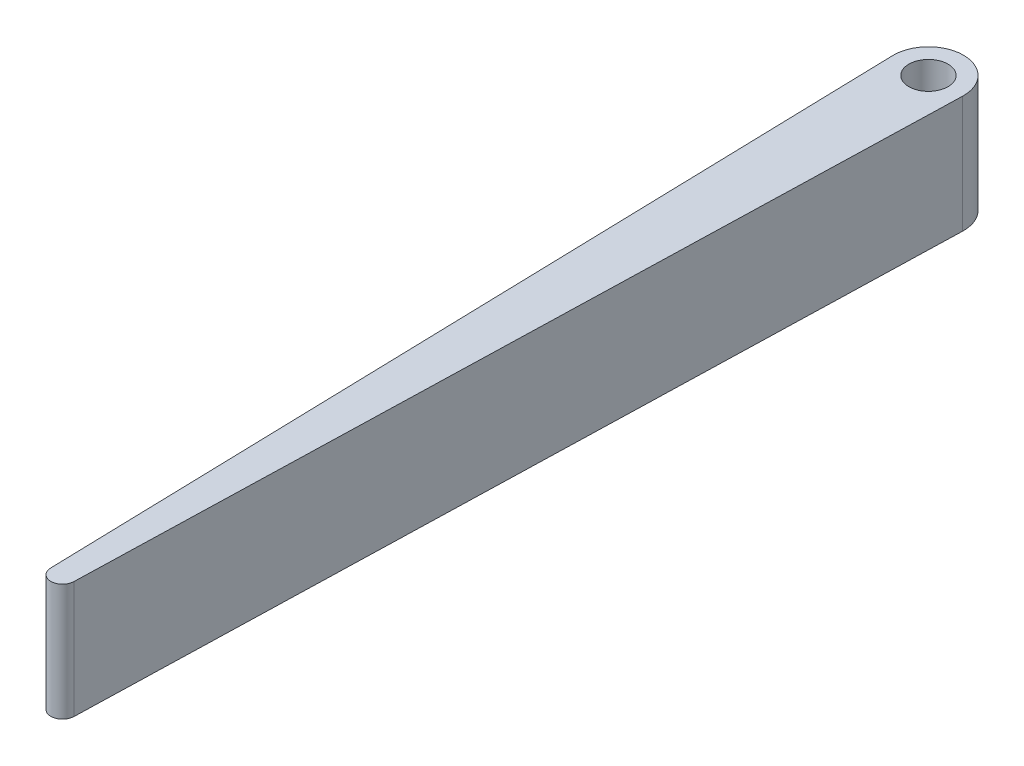
ISO-10303-21;
HEADER;
FILE_DESCRIPTION(('STEP AP214'),'2;1');
FILE_NAME('part.step','',(''),(''),'','','');
FILE_SCHEMA(('AUTOMOTIVE_DESIGN { 1 0 10303 214 1 1 1 1 }'));
ENDSEC;
DATA;
#1=APPLICATION_CONTEXT('core data for automotive mechanical design processes');
#2=APPLICATION_PROTOCOL_DEFINITION('international standard','automotive_design',2000,#1);
#3=PRODUCT_CONTEXT('',#1,'mechanical');
#4=PRODUCT('Part','Part','',(#3));
#5=PRODUCT_RELATED_PRODUCT_CATEGORY('part','',(#4));
#6=PRODUCT_DEFINITION_FORMATION('','',#4);
#7=PRODUCT_DEFINITION_CONTEXT('part definition',#1,'design');
#8=PRODUCT_DEFINITION('design','',#6,#7);
#9=PRODUCT_DEFINITION_SHAPE('','',#8);
#10=(LENGTH_UNIT() NAMED_UNIT(*) SI_UNIT(.MILLI.,.METRE.));
#11=(NAMED_UNIT(*) PLANE_ANGLE_UNIT() SI_UNIT($,.RADIAN.));
#12=(NAMED_UNIT(*) SI_UNIT($,.STERADIAN.) SOLID_ANGLE_UNIT());
#13=UNCERTAINTY_MEASURE_WITH_UNIT(LENGTH_MEASURE(1.E-05),#10,'distance_accuracy_value','');
#14=(GEOMETRIC_REPRESENTATION_CONTEXT(3) GLOBAL_UNCERTAINTY_ASSIGNED_CONTEXT((#13)) GLOBAL_UNIT_ASSIGNED_CONTEXT((#10,
#11,#12)) REPRESENTATION_CONTEXT('',''));
#15=CARTESIAN_POINT('',(0.,0.,0.));
#16=DIRECTION('',(0.,0.,1.));
#17=DIRECTION('',(1.,0.,0.));
#18=AXIS2_PLACEMENT_3D('',#15,#16,#17);
#19=CARTESIAN_POINT('',(0.,20.,0.));
#20=DIRECTION('',(0.,1.,0.));
#21=DIRECTION('',(0.,0.,1.));
#22=AXIS2_PLACEMENT_3D('',#19,#20,#21);
#23=PLANE('',#22);
#24=CARTESIAN_POINT('',(0.,20.,0.));
#25=DIRECTION('',(0.,1.,0.));
#26=DIRECTION('',(0.,0.,1.));
#27=AXIS2_PLACEMENT_3D('',#24,#25,#26);
#28=CIRCLE('',#27,6.);
#29=CARTESIAN_POINT('',(5.99769133044204,20.,0.166429278495057));
#30=VERTEX_POINT('',#29);
#31=CARTESIAN_POINT('',(-5.99792207407653,20.,0.157894880555203));
#32=VERTEX_POINT('',#31);
#33=EDGE_CURVE('E91',#30,#32,#28,.T.);
#34=ORIENTED_EDGE('',*,*,#33,.T.);
#35=DIRECTION('',(0.0263158134258671,0.,0.999653679012754));
#36=VECTOR('',#35,1.);
#37=CARTESIAN_POINT('',(-5.99792207407653,20.,0.157894880555203));
#38=LINE('',#37,#36);
#39=CARTESIAN_POINT('',(-2.10460342391427,20.,148.052632133027));
#40=VERTEX_POINT('',#39);
#41=EDGE_CURVE('E86',#32,#40,#38,.T.);
#42=ORIENTED_EDGE('',*,*,#41,.T.);
#43=CARTESIAN_POINT('',(-0.105296065888756,20.,148.000000506175));
#44=DIRECTION('',(0.,1.,0.));
#45=DIRECTION('',(0.,0.,-1.));
#46=AXIS2_PLACEMENT_3D('',#43,#44,#45);
#47=CIRCLE('',#46,2.);
#48=CARTESIAN_POINT('',(1.89393437759193,20.,148.05547693234));
#49=VERTEX_POINT('',#48);
#50=EDGE_CURVE('E89',#40,#49,#47,.T.);
#51=ORIENTED_EDGE('',*,*,#50,.T.);
#52=DIRECTION('',(0.0277382130825093,0.,-0.99961522174034));
#53=VECTOR('',#52,1.);
#54=CARTESIAN_POINT('',(5.99769133044204,20.,0.166429278495057));
#55=LINE('',#54,#53);
#56=EDGE_CURVE('E56',#49,#30,#55,.T.);
#57=ORIENTED_EDGE('',*,*,#56,.T.);
#58=EDGE_LOOP('',(#34,#42,#51,#57));
#59=FACE_BOUND('',#58,.T.);
#60=CARTESIAN_POINT('',(0.,20.,0.));
#61=DIRECTION('',(0.,1.,0.));
#62=DIRECTION('',(0.,0.,1.));
#63=AXIS2_PLACEMENT_3D('',#60,#61,#62);
#64=CIRCLE('',#63,3.35);
#65=CARTESIAN_POINT('',(0.,20.,3.35));
#66=VERTEX_POINT('',#65);
#67=EDGE_CURVE('E106',#66,#66,#64,.T.);
#68=ORIENTED_EDGE('',*,*,#67,.F.);
#69=EDGE_LOOP('',(#68));
#70=FACE_BOUND('',#69,.T.);
#71=ADVANCED_FACE('F39',(#59,#70),#23,.T.);
#72=CARTESIAN_POINT('',(0.,0.,0.));
#73=DIRECTION('',(0.,1.,0.));
#74=DIRECTION('',(0.,0.,1.));
#75=AXIS2_PLACEMENT_3D('',#72,#73,#74);
#76=PLANE('',#75);
#77=CARTESIAN_POINT('',(0.,0.,0.));
#78=DIRECTION('',(0.,1.,0.));
#79=DIRECTION('',(0.,0.,1.));
#80=AXIS2_PLACEMENT_3D('',#77,#78,#79);
#81=CIRCLE('',#80,6.);
#82=CARTESIAN_POINT('',(5.99769133044204,0.,0.166429278495057));
#83=VERTEX_POINT('',#82);
#84=CARTESIAN_POINT('',(-5.99792207407653,0.,0.157894880555203));
#85=VERTEX_POINT('',#84);
#86=EDGE_CURVE('E103',#83,#85,#81,.T.);
#87=ORIENTED_EDGE('',*,*,#86,.F.);
#88=DIRECTION('',(0.0277382130825093,0.,-0.99961522174034));
#89=VECTOR('',#88,1.);
#90=CARTESIAN_POINT('',(5.99769133044204,0.,0.166429278495057));
#91=LINE('',#90,#89);
#92=CARTESIAN_POINT('',(1.89393437759193,0.,148.05547693234));
#93=VERTEX_POINT('',#92);
#94=EDGE_CURVE('E79',#93,#83,#91,.T.);
#95=ORIENTED_EDGE('',*,*,#94,.F.);
#96=CARTESIAN_POINT('',(-0.105296065888756,0.,148.000000506175));
#97=DIRECTION('',(0.,1.,0.));
#98=DIRECTION('',(0.,0.,-1.));
#99=AXIS2_PLACEMENT_3D('',#96,#97,#98);
#100=CIRCLE('',#99,2.);
#101=CARTESIAN_POINT('',(-2.10460342391427,0.,148.052632133027));
#102=VERTEX_POINT('',#101);
#103=EDGE_CURVE('E73',#102,#93,#100,.T.);
#104=ORIENTED_EDGE('',*,*,#103,.F.);
#105=DIRECTION('',(0.0263158134258671,0.,0.999653679012754));
#106=VECTOR('',#105,1.);
#107=CARTESIAN_POINT('',(-5.99792207407653,0.,0.157894880555203));
#108=LINE('',#107,#106);
#109=EDGE_CURVE('E95',#85,#102,#108,.T.);
#110=ORIENTED_EDGE('',*,*,#109,.F.);
#111=EDGE_LOOP('',(#87,#95,#104,#110));
#112=FACE_BOUND('',#111,.T.);
#113=CARTESIAN_POINT('',(0.,0.,0.));
#114=DIRECTION('',(0.,1.,0.));
#115=DIRECTION('',(0.,0.,1.));
#116=AXIS2_PLACEMENT_3D('',#113,#114,#115);
#117=CIRCLE('',#116,3.35);
#118=CARTESIAN_POINT('',(0.,0.,3.35));
#119=VERTEX_POINT('',#118);
#120=EDGE_CURVE('E118',#119,#119,#117,.T.);
#121=ORIENTED_EDGE('',*,*,#120,.T.);
#122=EDGE_LOOP('',(#121));
#123=FACE_BOUND('',#122,.T.);
#124=ADVANCED_FACE('F114',(#112,#123),#76,.F.);
#125=CARTESIAN_POINT('',(0.,20.,0.));
#126=DIRECTION('',(0.,-1.,0.));
#127=DIRECTION('',(0.,0.,-1.));
#128=AXIS2_PLACEMENT_3D('',#125,#126,#127);
#129=CYLINDRICAL_SURFACE('',#128,6.);
#130=ORIENTED_EDGE('',*,*,#86,.T.);
#131=DIRECTION('',(0.,-1.,0.));
#132=VECTOR('',#131,1.);
#133=CARTESIAN_POINT('',(-5.99792207407653,20.,0.157894880555203));
#134=LINE('',#133,#132);
#135=EDGE_CURVE('E11',#32,#85,#134,.T.);
#136=ORIENTED_EDGE('',*,*,#135,.F.);
#137=ORIENTED_EDGE('',*,*,#33,.F.);
#138=DIRECTION('',(0.,-1.,0.));
#139=VECTOR('',#138,1.);
#140=CARTESIAN_POINT('',(5.99769133044204,20.,0.166429278495057));
#141=LINE('',#140,#139);
#142=EDGE_CURVE('E99',#30,#83,#141,.T.);
#143=ORIENTED_EDGE('',*,*,#142,.T.);
#144=EDGE_LOOP('',(#130,#136,#137,#143));
#145=FACE_BOUND('',#144,.T.);
#146=ADVANCED_FACE('F41',(#145),#129,.T.);
#147=CARTESIAN_POINT('',(-5.99792207407653,20.,0.157894880555203));
#148=DIRECTION('',(0.999653679012754,0.,-0.0263158134258671));
#149=DIRECTION('',(-0.0263158134258671,0.,-0.999653679012754));
#150=AXIS2_PLACEMENT_3D('',#147,#148,#149);
#151=PLANE('',#150);
#152=ORIENTED_EDGE('',*,*,#109,.T.);
#153=DIRECTION('',(0.,-1.,0.));
#154=VECTOR('',#153,1.);
#155=CARTESIAN_POINT('',(-2.10460342391427,20.,148.052632133027));
#156=LINE('',#155,#154);
#157=EDGE_CURVE('E48',#40,#102,#156,.T.);
#158=ORIENTED_EDGE('',*,*,#157,.F.);
#159=ORIENTED_EDGE('',*,*,#41,.F.);
#160=ORIENTED_EDGE('',*,*,#135,.T.);
#161=EDGE_LOOP('',(#152,#158,#159,#160));
#162=FACE_BOUND('',#161,.T.);
#163=ADVANCED_FACE('F94',(#162),#151,.F.);
#164=CARTESIAN_POINT('',(-0.105296065888756,20.,148.000000506175));
#165=DIRECTION('',(0.,-1.,0.));
#166=DIRECTION('',(0.,0.,-1.));
#167=AXIS2_PLACEMENT_3D('',#164,#165,#166);
#168=CYLINDRICAL_SURFACE('',#167,2.);
#169=ORIENTED_EDGE('',*,*,#103,.T.);
#170=DIRECTION('',(0.,-1.,0.));
#171=VECTOR('',#170,1.);
#172=CARTESIAN_POINT('',(1.89393437759193,20.,148.05547693234));
#173=LINE('',#172,#171);
#174=EDGE_CURVE('E96',#49,#93,#173,.T.);
#175=ORIENTED_EDGE('',*,*,#174,.F.);
#176=ORIENTED_EDGE('',*,*,#50,.F.);
#177=ORIENTED_EDGE('',*,*,#157,.T.);
#178=EDGE_LOOP('',(#169,#175,#176,#177));
#179=FACE_BOUND('',#178,.T.);
#180=ADVANCED_FACE('F97',(#179),#168,.T.);
#181=CARTESIAN_POINT('',(5.99769133044204,20.,0.166429278495057));
#182=DIRECTION('',(-0.99961522174034,0.,-0.0277382130825093));
#183=DIRECTION('',(-0.0277382130825093,0.,0.99961522174034));
#184=AXIS2_PLACEMENT_3D('',#181,#182,#183);
#185=PLANE('',#184);
#186=ORIENTED_EDGE('',*,*,#94,.T.);
#187=ORIENTED_EDGE('',*,*,#142,.F.);
#188=ORIENTED_EDGE('',*,*,#56,.F.);
#189=ORIENTED_EDGE('',*,*,#174,.T.);
#190=EDGE_LOOP('',(#186,#187,#188,#189));
#191=FACE_BOUND('',#190,.T.);
#192=ADVANCED_FACE('F111',(#191),#185,.F.);
#193=CARTESIAN_POINT('',(0.,20.,0.));
#194=DIRECTION('',(0.,-1.,0.));
#195=DIRECTION('',(0.,0.,-1.));
#196=AXIS2_PLACEMENT_3D('',#193,#194,#195);
#197=CYLINDRICAL_SURFACE('',#196,3.35);
#198=ORIENTED_EDGE('',*,*,#67,.T.);
#199=EDGE_LOOP('',(#198));
#200=FACE_BOUND('',#199,.T.);
#201=ORIENTED_EDGE('',*,*,#120,.F.);
#202=EDGE_LOOP('',(#201));
#203=FACE_BOUND('',#202,.T.);
#204=ADVANCED_FACE('F124',(#200,#203),#197,.F.);
#205=CLOSED_SHELL('',(#71,#124,#146,#163,#180,#192,#204));
#206=MANIFOLD_SOLID_BREP('B2',#205);
#207=ADVANCED_BREP_SHAPE_REPRESENTATION('',(#18,#206),#14);
#208=SHAPE_DEFINITION_REPRESENTATION(#9,#207);
ENDSEC;
END-ISO-10303-21;
